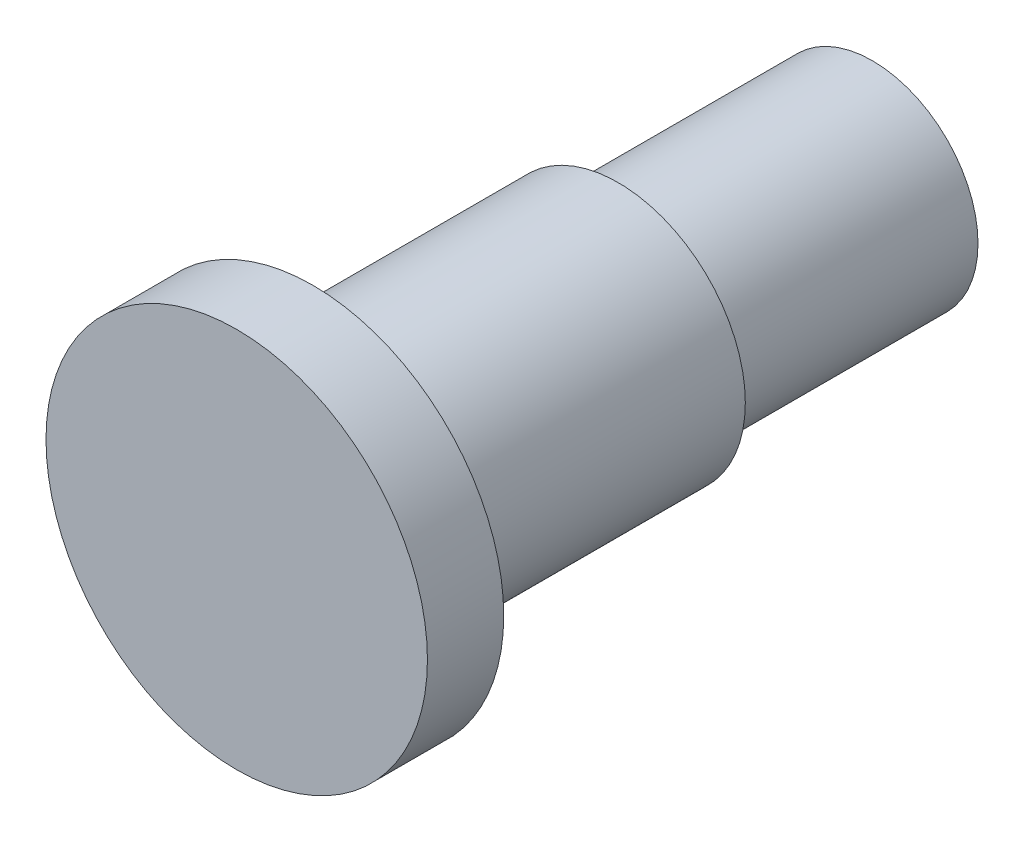
ISO-10303-21;
HEADER;
FILE_DESCRIPTION(('STEP AP214'),'2;1');
FILE_NAME('part.step','',(''),(''),'','','');
FILE_SCHEMA(('AUTOMOTIVE_DESIGN { 1 0 10303 214 1 1 1 1 }'));
ENDSEC;
DATA;
#1=APPLICATION_CONTEXT('core data for automotive mechanical design processes');
#2=APPLICATION_PROTOCOL_DEFINITION('international standard','automotive_design',2000,#1);
#3=PRODUCT_CONTEXT('',#1,'mechanical');
#4=PRODUCT('Part','Part','',(#3));
#5=PRODUCT_RELATED_PRODUCT_CATEGORY('part','',(#4));
#6=PRODUCT_DEFINITION_FORMATION('','',#4);
#7=PRODUCT_DEFINITION_CONTEXT('part definition',#1,'design');
#8=PRODUCT_DEFINITION('design','',#6,#7);
#9=PRODUCT_DEFINITION_SHAPE('','',#8);
#10=(LENGTH_UNIT() NAMED_UNIT(*) SI_UNIT(.MILLI.,.METRE.));
#11=(NAMED_UNIT(*) PLANE_ANGLE_UNIT() SI_UNIT($,.RADIAN.));
#12=(NAMED_UNIT(*) SI_UNIT($,.STERADIAN.) SOLID_ANGLE_UNIT());
#13=UNCERTAINTY_MEASURE_WITH_UNIT(LENGTH_MEASURE(1.E-05),#10,'distance_accuracy_value','');
#14=(GEOMETRIC_REPRESENTATION_CONTEXT(3) GLOBAL_UNCERTAINTY_ASSIGNED_CONTEXT((#13)) GLOBAL_UNIT_ASSIGNED_CONTEXT((#10,
#11,#12)) REPRESENTATION_CONTEXT('',''));
#15=CARTESIAN_POINT('',(0.,0.,0.));
#16=DIRECTION('',(0.,0.,1.));
#17=DIRECTION('',(1.,0.,0.));
#18=AXIS2_PLACEMENT_3D('',#15,#16,#17);
#19=CARTESIAN_POINT('',(0.,0.,0.));
#20=DIRECTION('',(0.,0.,-1.));
#21=DIRECTION('',(-1.,0.,0.));
#22=AXIS2_PLACEMENT_3D('',#19,#20,#21);
#23=CYLINDRICAL_SURFACE('',#22,4.15);
#24=CARTESIAN_POINT('',(0.,0.,0.));
#25=DIRECTION('',(0.,0.,1.));
#26=DIRECTION('',(1.,0.,0.));
#27=AXIS2_PLACEMENT_3D('',#24,#25,#26);
#28=CIRCLE('',#27,4.15);
#29=CARTESIAN_POINT('',(4.15,0.,0.));
#30=VERTEX_POINT('',#29);
#31=EDGE_CURVE('E10',#30,#30,#28,.T.);
#32=ORIENTED_EDGE('',*,*,#31,.F.);
#33=EDGE_LOOP('',(#32));
#34=FACE_BOUND('',#33,.T.);
#35=CARTESIAN_POINT('',(0.,0.,-10.));
#36=DIRECTION('',(0.,0.,1.));
#37=DIRECTION('',(1.,0.,0.));
#38=AXIS2_PLACEMENT_3D('',#35,#36,#37);
#39=CIRCLE('',#38,4.15);
#40=CARTESIAN_POINT('',(4.15,0.,-10.));
#41=VERTEX_POINT('',#40);
#42=EDGE_CURVE('E37',#41,#41,#39,.T.);
#43=ORIENTED_EDGE('',*,*,#42,.T.);
#44=EDGE_LOOP('',(#43));
#45=FACE_BOUND('',#44,.T.);
#46=ADVANCED_FACE('F40',(#34,#45),#23,.T.);
#47=CARTESIAN_POINT('',(0.,0.,-10.));
#48=DIRECTION('',(0.,0.,1.));
#49=DIRECTION('',(1.,0.,0.));
#50=AXIS2_PLACEMENT_3D('',#47,#48,#49);
#51=PLANE('',#50);
#52=ORIENTED_EDGE('',*,*,#42,.F.);
#53=EDGE_LOOP('',(#52));
#54=FACE_BOUND('',#53,.T.);
#55=ADVANCED_FACE('F79',(#54),#51,.F.);
#56=CARTESIAN_POINT('',(0.,0.,12.));
#57=DIRECTION('',(0.,0.,-1.));
#58=DIRECTION('',(-1.,0.,0.));
#59=AXIS2_PLACEMENT_3D('',#56,#57,#58);
#60=CYLINDRICAL_SURFACE('',#59,5.);
#61=CARTESIAN_POINT('',(0.,0.,12.));
#62=DIRECTION('',(0.,0.,1.));
#63=DIRECTION('',(1.,0.,0.));
#64=AXIS2_PLACEMENT_3D('',#61,#62,#63);
#65=CIRCLE('',#64,5.);
#66=CARTESIAN_POINT('',(5.,0.,12.));
#67=VERTEX_POINT('',#66);
#68=EDGE_CURVE('E50',#67,#67,#65,.T.);
#69=ORIENTED_EDGE('',*,*,#68,.F.);
#70=EDGE_LOOP('',(#69));
#71=FACE_BOUND('',#70,.T.);
#72=CARTESIAN_POINT('',(0.,0.,0.));
#73=DIRECTION('',(0.,0.,1.));
#74=DIRECTION('',(1.,0.,0.));
#75=AXIS2_PLACEMENT_3D('',#72,#73,#74);
#76=CIRCLE('',#75,5.);
#77=CARTESIAN_POINT('',(5.,0.,0.));
#78=VERTEX_POINT('',#77);
#79=EDGE_CURVE('E47',#78,#78,#76,.T.);
#80=ORIENTED_EDGE('',*,*,#79,.T.);
#81=EDGE_LOOP('',(#80));
#82=FACE_BOUND('',#81,.T.);
#83=ADVANCED_FACE('F84',(#71,#82),#60,.T.);
#84=CARTESIAN_POINT('',(0.,0.,0.));
#85=DIRECTION('',(0.,0.,1.));
#86=DIRECTION('',(1.,0.,0.));
#87=AXIS2_PLACEMENT_3D('',#84,#85,#86);
#88=PLANE('',#87);
#89=ORIENTED_EDGE('',*,*,#31,.T.);
#90=EDGE_LOOP('',(#89));
#91=FACE_BOUND('',#90,.T.);
#92=ORIENTED_EDGE('',*,*,#79,.F.);
#93=EDGE_LOOP('',(#92));
#94=FACE_BOUND('',#93,.T.);
#95=ADVANCED_FACE('F68',(#91,#94),#88,.F.);
#96=CARTESIAN_POINT('',(0.,0.,15.));
#97=DIRECTION('',(0.,0.,-1.));
#98=DIRECTION('',(-1.,0.,0.));
#99=AXIS2_PLACEMENT_3D('',#96,#97,#98);
#100=CYLINDRICAL_SURFACE('',#99,7.5);
#101=CARTESIAN_POINT('',(0.,0.,15.));
#102=DIRECTION('',(0.,0.,1.));
#103=DIRECTION('',(1.,0.,0.));
#104=AXIS2_PLACEMENT_3D('',#101,#102,#103);
#105=CIRCLE('',#104,7.5);
#106=CARTESIAN_POINT('',(7.5,0.,15.));
#107=VERTEX_POINT('',#106);
#108=EDGE_CURVE('E55',#107,#107,#105,.T.);
#109=ORIENTED_EDGE('',*,*,#108,.F.);
#110=EDGE_LOOP('',(#109));
#111=FACE_BOUND('',#110,.T.);
#112=CARTESIAN_POINT('',(0.,0.,12.));
#113=DIRECTION('',(0.,0.,1.));
#114=DIRECTION('',(1.,0.,0.));
#115=AXIS2_PLACEMENT_3D('',#112,#113,#114);
#116=CIRCLE('',#115,7.5);
#117=CARTESIAN_POINT('',(7.5,0.,12.));
#118=VERTEX_POINT('',#117);
#119=EDGE_CURVE('E54',#118,#118,#116,.T.);
#120=ORIENTED_EDGE('',*,*,#119,.T.);
#121=EDGE_LOOP('',(#120));
#122=FACE_BOUND('',#121,.T.);
#123=ADVANCED_FACE('F61',(#111,#122),#100,.T.);
#124=CARTESIAN_POINT('',(0.,0.,15.));
#125=DIRECTION('',(0.,0.,1.));
#126=DIRECTION('',(1.,0.,0.));
#127=AXIS2_PLACEMENT_3D('',#124,#125,#126);
#128=PLANE('',#127);
#129=ORIENTED_EDGE('',*,*,#108,.T.);
#130=EDGE_LOOP('',(#129));
#131=FACE_BOUND('',#130,.T.);
#132=ADVANCED_FACE('F63',(#131),#128,.T.);
#133=CARTESIAN_POINT('',(0.,0.,12.));
#134=DIRECTION('',(0.,0.,1.));
#135=DIRECTION('',(1.,0.,0.));
#136=AXIS2_PLACEMENT_3D('',#133,#134,#135);
#137=PLANE('',#136);
#138=ORIENTED_EDGE('',*,*,#68,.T.);
#139=EDGE_LOOP('',(#138));
#140=FACE_BOUND('',#139,.T.);
#141=ORIENTED_EDGE('',*,*,#119,.F.);
#142=EDGE_LOOP('',(#141));
#143=FACE_BOUND('',#142,.T.);
#144=ADVANCED_FACE('F67',(#140,#143),#137,.F.);
#145=CLOSED_SHELL('',(#46,#55,#83,#95,#123,#132,#144));
#146=MANIFOLD_SOLID_BREP('B2',#145);
#147=ADVANCED_BREP_SHAPE_REPRESENTATION('',(#18,#146),#14);
#148=SHAPE_DEFINITION_REPRESENTATION(#9,#147);
ENDSEC;
END-ISO-10303-21;
